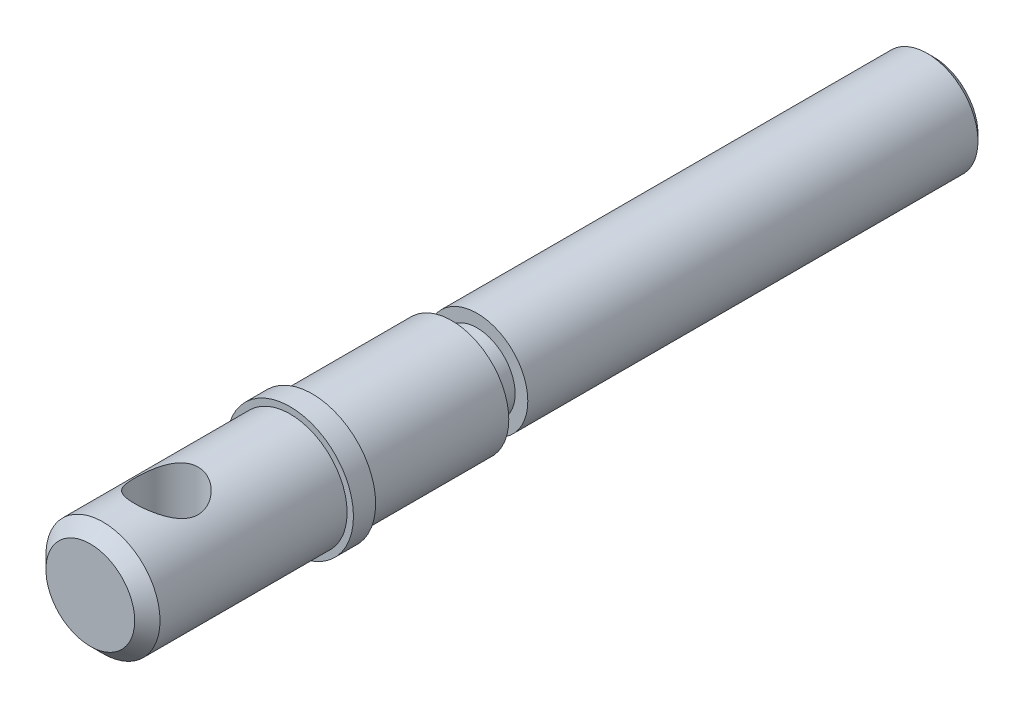
ISO-10303-21;
HEADER;
FILE_DESCRIPTION(('STEP AP214'),'2;1');
FILE_NAME('part.step','',(''),(''),'','','');
FILE_SCHEMA(('AUTOMOTIVE_DESIGN { 1 0 10303 214 1 1 1 1 }'));
ENDSEC;
DATA;
#1=APPLICATION_CONTEXT('core data for automotive mechanical design processes');
#2=APPLICATION_PROTOCOL_DEFINITION('international standard','automotive_design',2000,#1);
#3=PRODUCT_CONTEXT('',#1,'mechanical');
#4=PRODUCT('Part','Part','',(#3));
#5=PRODUCT_RELATED_PRODUCT_CATEGORY('part','',(#4));
#6=PRODUCT_DEFINITION_FORMATION('','',#4);
#7=PRODUCT_DEFINITION_CONTEXT('part definition',#1,'design');
#8=PRODUCT_DEFINITION('design','',#6,#7);
#9=PRODUCT_DEFINITION_SHAPE('','',#8);
#10=(LENGTH_UNIT() NAMED_UNIT(*) SI_UNIT(.MILLI.,.METRE.));
#11=(NAMED_UNIT(*) PLANE_ANGLE_UNIT() SI_UNIT($,.RADIAN.));
#12=(NAMED_UNIT(*) SI_UNIT($,.STERADIAN.) SOLID_ANGLE_UNIT());
#13=UNCERTAINTY_MEASURE_WITH_UNIT(LENGTH_MEASURE(1.E-05),#10,'distance_accuracy_value','');
#14=(GEOMETRIC_REPRESENTATION_CONTEXT(3) GLOBAL_UNCERTAINTY_ASSIGNED_CONTEXT((#13)) GLOBAL_UNIT_ASSIGNED_CONTEXT((#10,
#11,#12)) REPRESENTATION_CONTEXT('',''));
#15=CARTESIAN_POINT('',(0.,0.,0.));
#16=DIRECTION('',(0.,0.,1.));
#17=DIRECTION('',(1.,0.,0.));
#18=AXIS2_PLACEMENT_3D('',#15,#16,#17);
#19=CARTESIAN_POINT('',(0.,0.,72.));
#20=DIRECTION('',(0.,0.,-1.));
#21=DIRECTION('',(-1.,0.,0.));
#22=AXIS2_PLACEMENT_3D('',#19,#20,#21);
#23=CYLINDRICAL_SURFACE('',#22,8.);
#24=CARTESIAN_POINT('',(0.,0.,0.999999999999987));
#25=DIRECTION('',(0.,0.,1.));
#26=DIRECTION('',(1.,0.,0.));
#27=AXIS2_PLACEMENT_3D('',#24,#25,#26);
#28=CIRCLE('',#27,8.);
#29=CARTESIAN_POINT('',(8.,0.,0.999999999999987));
#30=VERTEX_POINT('',#29);
#31=EDGE_CURVE('E47',#30,#30,#28,.T.);
#32=ORIENTED_EDGE('',*,*,#31,.T.);
#33=EDGE_LOOP('',(#32));
#34=FACE_BOUND('',#33,.T.);
#35=CARTESIAN_POINT('',(0.,0.,72.));
#36=DIRECTION('',(0.,0.,1.));
#37=DIRECTION('',(1.,0.,0.));
#38=AXIS2_PLACEMENT_3D('',#35,#36,#37);
#39=CIRCLE('',#38,8.);
#40=CARTESIAN_POINT('',(8.,0.,72.));
#41=VERTEX_POINT('',#40);
#42=EDGE_CURVE('E141',#41,#41,#39,.T.);
#43=ORIENTED_EDGE('',*,*,#42,.F.);
#44=EDGE_LOOP('',(#43));
#45=FACE_BOUND('',#44,.T.);
#46=ADVANCED_FACE('F34',(#34,#45),#23,.T.);
#47=CARTESIAN_POINT('',(0.,0.,72.));
#48=DIRECTION('',(0.,0.,1.));
#49=DIRECTION('',(1.,0.,0.));
#50=AXIS2_PLACEMENT_3D('',#47,#48,#49);
#51=PLANE('',#50);
#52=CARTESIAN_POINT('',(0.,0.,72.));
#53=DIRECTION('',(0.,0.,1.));
#54=DIRECTION('',(1.,0.,0.));
#55=AXIS2_PLACEMENT_3D('',#52,#53,#54);
#56=CIRCLE('',#55,6.);
#57=CARTESIAN_POINT('',(6.,0.,72.));
#58=VERTEX_POINT('',#57);
#59=EDGE_CURVE('E136',#58,#58,#56,.T.);
#60=ORIENTED_EDGE('',*,*,#59,.F.);
#61=EDGE_LOOP('',(#60));
#62=FACE_BOUND('',#61,.T.);
#63=ORIENTED_EDGE('',*,*,#42,.T.);
#64=EDGE_LOOP('',(#63));
#65=FACE_BOUND('',#64,.T.);
#66=ADVANCED_FACE('F82',(#62,#65),#51,.T.);
#67=CARTESIAN_POINT('',(0.,0.,0.));
#68=DIRECTION('',(0.,0.,1.));
#69=DIRECTION('',(1.,0.,0.));
#70=AXIS2_PLACEMENT_3D('',#67,#68,#69);
#71=PLANE('',#70);
#72=CARTESIAN_POINT('',(0.,0.,0.));
#73=DIRECTION('',(0.,0.,1.));
#74=DIRECTION('',(1.,0.,0.));
#75=AXIS2_PLACEMENT_3D('',#72,#73,#74);
#76=CIRCLE('',#75,7.00000000000001);
#77=CARTESIAN_POINT('',(7.00000000000001,0.,0.));
#78=VERTEX_POINT('',#77);
#79=EDGE_CURVE('E10',#78,#78,#76,.F.);
#80=ORIENTED_EDGE('',*,*,#79,.T.);
#81=EDGE_LOOP('',(#80));
#82=FACE_BOUND('',#81,.T.);
#83=ADVANCED_FACE('F88',(#82),#71,.F.);
#84=CARTESIAN_POINT('',(0.,0.,76.));
#85=DIRECTION('',(0.,0.,-1.));
#86=DIRECTION('',(-1.,0.,0.));
#87=AXIS2_PLACEMENT_3D('',#84,#85,#86);
#88=CYLINDRICAL_SURFACE('',#87,6.);
#89=CARTESIAN_POINT('',(0.,0.,76.));
#90=DIRECTION('',(0.,0.,1.));
#91=DIRECTION('',(1.,0.,0.));
#92=AXIS2_PLACEMENT_3D('',#89,#90,#91);
#93=CIRCLE('',#92,6.);
#94=CARTESIAN_POINT('',(6.,0.,76.));
#95=VERTEX_POINT('',#94);
#96=EDGE_CURVE('E138',#95,#95,#93,.T.);
#97=ORIENTED_EDGE('',*,*,#96,.F.);
#98=EDGE_LOOP('',(#97));
#99=FACE_BOUND('',#98,.T.);
#100=ORIENTED_EDGE('',*,*,#59,.T.);
#101=EDGE_LOOP('',(#100));
#102=FACE_BOUND('',#101,.T.);
#103=ADVANCED_FACE('F94',(#99,#102),#88,.T.);
#104=CARTESIAN_POINT('',(0.,0.,98.));
#105=DIRECTION('',(0.,0.,-1.));
#106=DIRECTION('',(-1.,0.,0.));
#107=AXIS2_PLACEMENT_3D('',#104,#105,#106);
#108=CYLINDRICAL_SURFACE('',#107,9.);
#109=CARTESIAN_POINT('',(0.,0.,98.));
#110=DIRECTION('',(0.,0.,1.));
#111=DIRECTION('',(1.,0.,0.));
#112=AXIS2_PLACEMENT_3D('',#109,#110,#111);
#113=CIRCLE('',#112,9.);
#114=CARTESIAN_POINT('',(9.,0.,98.));
#115=VERTEX_POINT('',#114);
#116=EDGE_CURVE('E129',#115,#115,#113,.T.);
#117=ORIENTED_EDGE('',*,*,#116,.F.);
#118=EDGE_LOOP('',(#117));
#119=FACE_BOUND('',#118,.T.);
#120=CARTESIAN_POINT('',(0.,0.,76.));
#121=DIRECTION('',(0.,0.,1.));
#122=DIRECTION('',(1.,0.,0.));
#123=AXIS2_PLACEMENT_3D('',#120,#121,#122);
#124=CIRCLE('',#123,9.);
#125=CARTESIAN_POINT('',(9.,0.,76.));
#126=VERTEX_POINT('',#125);
#127=EDGE_CURVE('E125',#126,#126,#124,.T.);
#128=ORIENTED_EDGE('',*,*,#127,.T.);
#129=EDGE_LOOP('',(#128));
#130=FACE_BOUND('',#129,.T.);
#131=ADVANCED_FACE('F98',(#119,#130),#108,.T.);
#132=CARTESIAN_POINT('',(0.,0.,76.));
#133=DIRECTION('',(0.,0.,1.));
#134=DIRECTION('',(1.,0.,0.));
#135=AXIS2_PLACEMENT_3D('',#132,#133,#134);
#136=PLANE('',#135);
#137=ORIENTED_EDGE('',*,*,#96,.T.);
#138=EDGE_LOOP('',(#137));
#139=FACE_BOUND('',#138,.T.);
#140=ORIENTED_EDGE('',*,*,#127,.F.);
#141=EDGE_LOOP('',(#140));
#142=FACE_BOUND('',#141,.T.);
#143=ADVANCED_FACE('F102',(#139,#142),#136,.F.);
#144=CARTESIAN_POINT('',(0.,0.,101.5));
#145=DIRECTION('',(0.,0.,-1.));
#146=DIRECTION('',(-1.,0.,0.));
#147=AXIS2_PLACEMENT_3D('',#144,#145,#146);
#148=CYLINDRICAL_SURFACE('',#147,10.);
#149=CARTESIAN_POINT('',(0.,0.,101.5));
#150=DIRECTION('',(0.,0.,1.));
#151=DIRECTION('',(1.,0.,0.));
#152=AXIS2_PLACEMENT_3D('',#149,#150,#151);
#153=CIRCLE('',#152,10.);
#154=CARTESIAN_POINT('',(10.,0.,101.5));
#155=VERTEX_POINT('',#154);
#156=EDGE_CURVE('E124',#155,#155,#153,.T.);
#157=ORIENTED_EDGE('',*,*,#156,.F.);
#158=EDGE_LOOP('',(#157));
#159=FACE_BOUND('',#158,.T.);
#160=CARTESIAN_POINT('',(0.,0.,98.));
#161=DIRECTION('',(0.,0.,1.));
#162=DIRECTION('',(1.,0.,0.));
#163=AXIS2_PLACEMENT_3D('',#160,#161,#162);
#164=CIRCLE('',#163,10.);
#165=CARTESIAN_POINT('',(10.,0.,98.));
#166=VERTEX_POINT('',#165);
#167=EDGE_CURVE('E126',#166,#166,#164,.T.);
#168=ORIENTED_EDGE('',*,*,#167,.T.);
#169=EDGE_LOOP('',(#168));
#170=FACE_BOUND('',#169,.T.);
#171=ADVANCED_FACE('F106',(#159,#170),#148,.T.);
#172=CARTESIAN_POINT('',(0.,0.,101.5));
#173=DIRECTION('',(0.,0.,1.));
#174=DIRECTION('',(1.,0.,0.));
#175=AXIS2_PLACEMENT_3D('',#172,#173,#174);
#176=PLANE('',#175);
#177=CARTESIAN_POINT('',(0.,0.,101.5));
#178=DIRECTION('',(0.,0.,1.));
#179=DIRECTION('',(1.,0.,0.));
#180=AXIS2_PLACEMENT_3D('',#177,#178,#179);
#181=CIRCLE('',#180,9.);
#182=CARTESIAN_POINT('',(9.,0.,101.5));
#183=VERTEX_POINT('',#182);
#184=EDGE_CURVE('E121',#183,#183,#181,.T.);
#185=ORIENTED_EDGE('',*,*,#184,.F.);
#186=EDGE_LOOP('',(#185));
#187=FACE_BOUND('',#186,.T.);
#188=ORIENTED_EDGE('',*,*,#156,.T.);
#189=EDGE_LOOP('',(#188));
#190=FACE_BOUND('',#189,.T.);
#191=ADVANCED_FACE('F110',(#187,#190),#176,.T.);
#192=CARTESIAN_POINT('',(0.,0.,98.));
#193=DIRECTION('',(0.,0.,1.));
#194=DIRECTION('',(1.,0.,0.));
#195=AXIS2_PLACEMENT_3D('',#192,#193,#194);
#196=PLANE('',#195);
#197=ORIENTED_EDGE('',*,*,#116,.T.);
#198=EDGE_LOOP('',(#197));
#199=FACE_BOUND('',#198,.T.);
#200=ORIENTED_EDGE('',*,*,#167,.F.);
#201=EDGE_LOOP('',(#200));
#202=FACE_BOUND('',#201,.T.);
#203=ADVANCED_FACE('F78',(#199,#202),#196,.F.);
#204=CARTESIAN_POINT('',(0.,0.,133.));
#205=DIRECTION('',(0.,0.,-1.));
#206=DIRECTION('',(-1.,0.,0.));
#207=AXIS2_PLACEMENT_3D('',#204,#205,#206);
#208=CYLINDRICAL_SURFACE('',#207,9.);
#209=CARTESIAN_POINT('',(0.,-9.,126.));
#210=CARTESIAN_POINT('',(0.129728650098871,-9.00000035367436,126.000000403498));
#211=CARTESIAN_POINT('',(0.259452073794095,-8.99718916475518,125.994945729159));
#212=CARTESIAN_POINT('',(0.517921555695227,-8.98601661845686,125.974792995682));
#213=CARTESIAN_POINT('',(0.646667254114375,-8.97765330942365,125.959691404897));
#214=CARTESIAN_POINT('',(0.902114816809583,-8.955591631334,125.919644306576));
#215=CARTESIAN_POINT('',(1.02881719751597,-8.94189463304535,125.894701328271));
#216=CARTESIAN_POINT('',(1.27935747075157,-8.90950110249539,125.835269365724));
#217=CARTESIAN_POINT('',(1.40319416175913,-8.89080251301058,125.800776453257));
#218=CARTESIAN_POINT('',(1.64664425181188,-8.84894060668929,125.722798818713));
#219=CARTESIAN_POINT('',(1.76627303289198,-8.82579612337894,125.679351972301));
#220=CARTESIAN_POINT('',(2.0011801532576,-8.77551906926368,125.583816843195));
#221=CARTESIAN_POINT('',(2.11645683188322,-8.7483849950735,125.531725301991));
#222=CARTESIAN_POINT('',(2.45478877397504,-8.6618736377096,125.363188450332));
#223=CARTESIAN_POINT('',(2.67053417661058,-8.59735346727595,125.234419881894));
#224=CARTESIAN_POINT('',(3.09271229088072,-8.45507241221886,124.937807686347));
#225=CARTESIAN_POINT('',(3.29745415964199,-8.37670278285858,124.767869515605));
#226=CARTESIAN_POINT('',(3.67715998948636,-8.21711406392093,124.398353874186));
#227=CARTESIAN_POINT('',(3.85209353794296,-8.13589216491853,124.198746516894));
#228=CARTESIAN_POINT('',(4.18516795747926,-7.97009263226157,123.751305826588));
#229=CARTESIAN_POINT('',(4.33981028101033,-7.88600912242673,123.500635163402));
#230=CARTESIAN_POINT('',(4.53792036965586,-7.77258662819673,123.104541121703));
#231=CARTESIAN_POINT('',(4.59831134885592,-7.73689861013125,122.96917342162));
#232=CARTESIAN_POINT('',(4.70719976108134,-7.67113380801424,122.692446845762));
#233=CARTESIAN_POINT('',(4.75570081097956,-7.64105531823258,122.551089807306));
#234=CARTESIAN_POINT('',(4.86451848682886,-7.57250099477048,122.179994316547));
#235=CARTESIAN_POINT('',(4.91545327804221,-7.53922489494338,121.946409780324));
#236=CARTESIAN_POINT('',(4.98336969334309,-7.49451395010562,121.472499613024));
#237=CARTESIAN_POINT('',(5.00038478617411,-7.48305757595619,121.232180864358));
#238=CARTESIAN_POINT('',(4.99960164647186,-7.48358103631205,120.751345647922));
#239=CARTESIAN_POINT('',(4.98176529219689,-7.49558653424254,120.510829251615));
#240=CARTESIAN_POINT('',(4.91220969738461,-7.54134329912877,120.036841924041));
#241=CARTESIAN_POINT('',(4.86046842450359,-7.57510870603263,119.803375677421));
#242=CARTESIAN_POINT('',(4.72555331937599,-7.65998850707494,119.349136455253));
#243=CARTESIAN_POINT('',(4.64237249870864,-7.71110675816709,119.12836631439));
#244=CARTESIAN_POINT('',(4.447403175792,-7.82517266123029,118.703183346419));
#245=CARTESIAN_POINT('',(4.33560350009452,-7.88812493091397,118.498776949099));
#246=CARTESIAN_POINT('',(4.06693738507512,-8.03034742050394,118.079179713751));
#247=CARTESIAN_POINT('',(3.90580419516378,-8.11064361563465,117.867070495966));
#248=CARTESIAN_POINT('',(3.55190169354529,-8.27174396528661,117.470901072121));
#249=CARTESIAN_POINT('',(3.35910741508491,-8.3525484718906,117.286863224796));
#250=CARTESIAN_POINT('',(3.03820334696237,-8.47255594770407,117.026220382037));
#251=CARTESIAN_POINT('',(2.91988181005322,-8.51415799334354,116.938461097182));
#252=CARTESIAN_POINT('',(2.67521853140361,-8.59416899062468,116.773303132516));
#253=CARTESIAN_POINT('',(2.54887988004621,-8.63257915962084,116.695900495832));
#254=CARTESIAN_POINT('',(2.28891079019194,-8.70511911408219,116.55219791443));
#255=CARTESIAN_POINT('',(2.15528226330413,-8.73925001402195,116.485895077413));
#256=CARTESIAN_POINT('',(1.88158110652943,-8.80223607285831,116.365130437124));
#257=CARTESIAN_POINT('',(1.74150926341687,-8.83109187375265,116.31066719278));
#258=CARTESIAN_POINT('',(1.46611496312215,-8.88080389711844,116.217729967547));
#259=CARTESIAN_POINT('',(1.33115857131801,-8.90208189584859,116.178396846012));
#260=CARTESIAN_POINT('',(1.05765459084792,-8.9387020465349,116.111115438226));
#261=CARTESIAN_POINT('',(0.919107474489839,-8.95404497497797,116.083165662663));
#262=CARTESIAN_POINT('',(0.639688147055645,-8.97833234249118,116.039073648357));
#263=CARTESIAN_POINT('',(0.498817610939243,-8.98728120107926,116.022923253825));
#264=CARTESIAN_POINT('',(0.21595409747849,-8.99852157239254,116.002654386665));
#265=CARTESIAN_POINT('',(0.0739612319193928,-9.00081373995796,115.998534730534));
#266=CARTESIAN_POINT('',(-0.193661310485767,-8.99879540596083,116.002168773458));
#267=CARTESIAN_POINT('',(-0.319316398566573,-8.99520578290284,116.008626111893));
#268=CARTESIAN_POINT('',(-0.569568337701521,-8.98283315150498,116.030958036991));
#269=CARTESIAN_POINT('',(-0.69416485012835,-8.97404854042271,116.046835529937));
#270=CARTESIAN_POINT('',(-0.941327320488158,-8.95149651046085,116.087812709104));
#271=CARTESIAN_POINT('',(-1.06389401822775,-8.93773095073358,116.112908954455));
#272=CARTESIAN_POINT('',(-1.30624674826635,-8.9055432099694,116.172028885866));
#273=CARTESIAN_POINT('',(-1.42603168935625,-8.88711923415738,116.206056012973));
#274=CARTESIAN_POINT('',(-1.77910695000251,-8.82561614200696,116.320713609234));
#275=CARTESIAN_POINT('',(-2.00729552902006,-8.77619255116918,116.414119496742));
#276=CARTESIAN_POINT('',(-2.44488800886301,-8.66450874935681,116.631660166924));
#277=CARTESIAN_POINT('',(-2.65428686245935,-8.6022451040581,116.75580317263));
#278=CARTESIAN_POINT('',(-3.07172957903526,-8.46272453532917,117.045821972293));
#279=CARTESIAN_POINT('',(-3.27740782973052,-8.38458363909743,117.214680855635));
#280=CARTESIAN_POINT('',(-3.65908152653597,-8.22520611371521,117.582186795455));
#281=CARTESIAN_POINT('',(-3.83504389654575,-8.14396615672223,117.780866586534));
#282=CARTESIAN_POINT('',(-4.17023823002671,-7.97793731767648,118.226123095256));
#283=CARTESIAN_POINT('',(-4.32600004905647,-7.89361512920965,118.475508481209));
#284=CARTESIAN_POINT('',(-4.59275891633597,-7.74146523733294,119.001689370523));
#285=CARTESIAN_POINT('',(-4.70381927827813,-7.67361425911822,119.278445409452));
#286=CARTESIAN_POINT('',(-4.85777774830002,-7.57683809208936,119.792433927955));
#287=CARTESIAN_POINT('',(-4.91005771973349,-7.5427474465653,120.025882534407));
#288=CARTESIAN_POINT('',(-4.98067851749207,-7.49631291383466,120.499893284941));
#289=CARTESIAN_POINT('',(-4.99905324495845,-7.48394730481337,120.740448078837));
#290=CARTESIAN_POINT('',(-5.00087641660016,-7.4827292389407,121.222043485471));
#291=CARTESIAN_POINT('',(-4.98428138030366,-7.49390605410459,121.463084330288));
#292=CARTESIAN_POINT('',(-4.91703272116073,-7.5381922351137,121.938336075563));
#293=CARTESIAN_POINT('',(-4.86635734965788,-7.57131560614076,122.172542514943));
#294=CARTESIAN_POINT('',(-4.73359019709714,-7.65501053053173,122.627637340616));
#295=CARTESIAN_POINT('',(-4.65159333262121,-7.7055293237003,122.848563652545));
#296=CARTESIAN_POINT('',(-4.45898685237774,-7.81855933555385,123.274218021757));
#297=CARTESIAN_POINT('',(-4.34836621460617,-7.88107517147513,123.478939799502));
#298=CARTESIAN_POINT('',(-4.08239378948777,-8.02246926398218,123.899118337509));
#299=CARTESIAN_POINT('',(-3.92281334521186,-8.10239358916594,124.111543878647));
#300=CARTESIAN_POINT('',(-3.57208449742688,-8.26301218742008,124.508615204111));
#301=CARTESIAN_POINT('',(-3.38091059241462,-8.34370703244943,124.693238314983));
#302=CARTESIAN_POINT('',(-3.06226198232623,-8.46388232404898,124.955266470803));
#303=CARTESIAN_POINT('',(-2.94454455618599,-8.50565265713109,125.043691062892));
#304=CARTESIAN_POINT('',(-2.70104919272108,-8.5860784208833,125.210233533147));
#305=CARTESIAN_POINT('',(-2.57527433671188,-8.62473502968511,125.288355316759));
#306=CARTESIAN_POINT('',(-2.31639114532808,-8.69784009103004,125.43354865083));
#307=CARTESIAN_POINT('',(-2.18328521880677,-8.73228991401566,125.500623802441));
#308=CARTESIAN_POINT('',(-1.91056755470904,-8.79598351699736,125.622992228043));
#309=CARTESIAN_POINT('',(-1.77095673345214,-8.82522802746501,125.678287155392));
#310=CARTESIAN_POINT('',(-1.49912870468087,-8.87524400995768,125.771936373452));
#311=CARTESIAN_POINT('',(-1.36737917982355,-8.89654158296884,125.811368321224));
#312=CARTESIAN_POINT('',(-1.10033791857094,-8.93349970483441,125.879368096818));
#313=CARTESIAN_POINT('',(-0.965046657250126,-8.94916100560194,125.907937373815));
#314=CARTESIAN_POINT('',(-0.692088324433112,-8.97439622187978,125.953802009618));
#315=CARTESIAN_POINT('',(-0.554422765939952,-8.98397387690143,125.971104294214));
#316=CARTESIAN_POINT('',(-0.277836098507378,-8.99677541735903,125.994202784995));
#317=CARTESIAN_POINT('',(-0.138915052853805,-8.9999996212811,125.999999567929));
#318=CARTESIAN_POINT('',(0.,-9.,126.));
#319=B_SPLINE_CURVE_WITH_KNOTS('',3,(#209,#210,#211,#212,#213,#214,#215,#216,#217,#218,#219,
#220,#221,#222,#223,#224,#225,#226,#227,#228,#229,#230,#231,#232,#233,#234,#235,#236,#237,#238,
#239,#240,#241,#242,#243,#244,#245,#246,#247,#248,#249,#250,#251,#252,#253,#254,#255,#256,#257,
#258,#259,#260,#261,#262,#263,#264,#265,#266,#267,#268,#269,#270,#271,#272,#273,#274,#275,#276,
#277,#278,#279,#280,#281,#282,#283,#284,#285,#286,#287,#288,#289,#290,#291,#292,#293,#294,#295,
#296,#297,#298,#299,#300,#301,#302,#303,#304,#305,#306,#307,#308,#309,#310,#311,#312,#313,#314,
#315,#316,#317,#318),.UNSPECIFIED.,.T.,.F.,(4,2,2,2,2,2,2,2,2,2,2,2,2,2,2,2,2,2,2,2,2,2,2,2,2,2,
2,2,2,2,2,2,2,2,2,2,2,2,2,2,2,2,2,2,2,2,2,2,2,2,2,2,2,2,4),(0.,0.389049038673796,
0.778234906423186,1.16732081864409,1.55656701401969,1.94419928087583,2.33197799415706,
3.10694003691383,3.93579164360749,4.76548390659347,5.67926108729745,6.13607645300719,
6.59275268424476,7.31346839098545,8.03347261109579,8.75426483810458,9.47552592073739,
10.1969474205329,10.9186510103256,11.7500289468904,12.5820656531715,13.0407937204138,
13.4993460219527,13.9577786509197,14.4161554498582,14.8420733324614,15.2679354732486,
15.6935029768355,16.1190286145523,16.4961868590171,16.8734615239822,17.2505955151925,
17.6278750290088,18.3788772686743,19.1300806397395,19.9587345054797,20.7883047338674,
21.7014293455293,22.613256047122,23.3350470842321,24.0561160257529,24.778082054147,
25.5005092490548,26.2207643506841,26.9412972109114,27.7704094124313,28.6001941523198,
29.05881328468,29.5172580673313,29.9755531019595,30.4337837723653,30.8507153459596,
31.2675912777015,31.684210714444,32.100809266336),.UNSPECIFIED.);
#320=CARTESIAN_POINT('',(0.,-9.,126.));
#321=VERTEX_POINT('',#320);
#322=EDGE_CURVE('E38',#321,#321,#319,.T.);
#323=ORIENTED_EDGE('',*,*,#322,.T.);
#324=EDGE_LOOP('',(#323));
#325=FACE_BOUND('',#324,.T.);
#326=CARTESIAN_POINT('',(0.,9.,126.));
#327=CARTESIAN_POINT('',(-0.129728650098871,9.00000035367436,126.000000403498));
#328=CARTESIAN_POINT('',(-0.259452073794095,8.99718916475518,125.994945729159));
#329=CARTESIAN_POINT('',(-0.517921555695227,8.98601661845686,125.974792995682));
#330=CARTESIAN_POINT('',(-0.646667254114375,8.97765330942365,125.959691404897));
#331=CARTESIAN_POINT('',(-0.902114816809583,8.955591631334,125.919644306576));
#332=CARTESIAN_POINT('',(-1.02881719751597,8.94189463304535,125.894701328271));
#333=CARTESIAN_POINT('',(-1.27935747075157,8.90950110249539,125.835269365724));
#334=CARTESIAN_POINT('',(-1.40319416175913,8.89080251301058,125.800776453257));
#335=CARTESIAN_POINT('',(-1.64664425181188,8.84894060668929,125.722798818713));
#336=CARTESIAN_POINT('',(-1.76627303289198,8.82579612337894,125.679351972301));
#337=CARTESIAN_POINT('',(-2.0011801532576,8.77551906926368,125.583816843195));
#338=CARTESIAN_POINT('',(-2.11645683188322,8.7483849950735,125.531725301991));
#339=CARTESIAN_POINT('',(-2.45478877397504,8.6618736377096,125.363188450332));
#340=CARTESIAN_POINT('',(-2.67053417661058,8.59735346727595,125.234419881894));
#341=CARTESIAN_POINT('',(-3.09271229088072,8.45507241221886,124.937807686347));
#342=CARTESIAN_POINT('',(-3.29745415964199,8.37670278285858,124.767869515605));
#343=CARTESIAN_POINT('',(-3.67715998948636,8.21711406392093,124.398353874186));
#344=CARTESIAN_POINT('',(-3.85209353794296,8.13589216491853,124.198746516894));
#345=CARTESIAN_POINT('',(-4.18516795747926,7.97009263226157,123.751305826588));
#346=CARTESIAN_POINT('',(-4.33981028101033,7.88600912242673,123.500635163402));
#347=CARTESIAN_POINT('',(-4.53792036965586,7.77258662819673,123.104541121703));
#348=CARTESIAN_POINT('',(-4.59831134885592,7.73689861013125,122.96917342162));
#349=CARTESIAN_POINT('',(-4.70719976108134,7.67113380801424,122.692446845762));
#350=CARTESIAN_POINT('',(-4.75570081097956,7.64105531823258,122.551089807306));
#351=CARTESIAN_POINT('',(-4.86451848682886,7.57250099477048,122.179994316547));
#352=CARTESIAN_POINT('',(-4.91545327804221,7.53922489494338,121.946409780324));
#353=CARTESIAN_POINT('',(-4.98336969334309,7.49451395010562,121.472499613024));
#354=CARTESIAN_POINT('',(-5.00038478617411,7.48305757595619,121.232180864358));
#355=CARTESIAN_POINT('',(-4.99960164647186,7.48358103631205,120.751345647922));
#356=CARTESIAN_POINT('',(-4.98176529219689,7.49558653424254,120.510829251615));
#357=CARTESIAN_POINT('',(-4.91220969738461,7.54134329912877,120.036841924041));
#358=CARTESIAN_POINT('',(-4.86046842450359,7.57510870603263,119.803375677421));
#359=CARTESIAN_POINT('',(-4.72555331937599,7.65998850707494,119.349136455253));
#360=CARTESIAN_POINT('',(-4.64237249870864,7.71110675816709,119.12836631439));
#361=CARTESIAN_POINT('',(-4.447403175792,7.82517266123029,118.703183346419));
#362=CARTESIAN_POINT('',(-4.33560350009452,7.88812493091397,118.498776949099));
#363=CARTESIAN_POINT('',(-4.06693738507512,8.03034742050394,118.079179713751));
#364=CARTESIAN_POINT('',(-3.90580419516378,8.11064361563465,117.867070495966));
#365=CARTESIAN_POINT('',(-3.55190169354529,8.27174396528661,117.470901072121));
#366=CARTESIAN_POINT('',(-3.35910741508491,8.3525484718906,117.286863224796));
#367=CARTESIAN_POINT('',(-3.03820334696237,8.47255594770407,117.026220382037));
#368=CARTESIAN_POINT('',(-2.91988181005322,8.51415799334354,116.938461097182));
#369=CARTESIAN_POINT('',(-2.67521853140361,8.59416899062468,116.773303132516));
#370=CARTESIAN_POINT('',(-2.54887988004621,8.63257915962084,116.695900495832));
#371=CARTESIAN_POINT('',(-2.28891079019194,8.70511911408219,116.55219791443));
#372=CARTESIAN_POINT('',(-2.15528226330413,8.73925001402195,116.485895077413));
#373=CARTESIAN_POINT('',(-1.88158110652943,8.80223607285831,116.365130437124));
#374=CARTESIAN_POINT('',(-1.74150926341687,8.83109187375265,116.31066719278));
#375=CARTESIAN_POINT('',(-1.46611496312215,8.88080389711844,116.217729967547));
#376=CARTESIAN_POINT('',(-1.33115857131801,8.90208189584859,116.178396846012));
#377=CARTESIAN_POINT('',(-1.05765459084792,8.9387020465349,116.111115438226));
#378=CARTESIAN_POINT('',(-0.919107474489839,8.95404497497797,116.083165662663));
#379=CARTESIAN_POINT('',(-0.639688147055645,8.97833234249118,116.039073648357));
#380=CARTESIAN_POINT('',(-0.498817610939243,8.98728120107926,116.022923253825));
#381=CARTESIAN_POINT('',(-0.21595409747849,8.99852157239254,116.002654386665));
#382=CARTESIAN_POINT('',(-0.0739612319193928,9.00081373995796,115.998534730534));
#383=CARTESIAN_POINT('',(0.193661310485767,8.99879540596083,116.002168773458));
#384=CARTESIAN_POINT('',(0.319316398566573,8.99520578290284,116.008626111893));
#385=CARTESIAN_POINT('',(0.569568337701521,8.98283315150498,116.030958036991));
#386=CARTESIAN_POINT('',(0.69416485012835,8.97404854042271,116.046835529937));
#387=CARTESIAN_POINT('',(0.941327320488158,8.95149651046085,116.087812709104));
#388=CARTESIAN_POINT('',(1.06389401822775,8.93773095073358,116.112908954455));
#389=CARTESIAN_POINT('',(1.30624674826635,8.9055432099694,116.172028885866));
#390=CARTESIAN_POINT('',(1.42603168935625,8.88711923415738,116.206056012973));
#391=CARTESIAN_POINT('',(1.77910695000251,8.82561614200696,116.320713609234));
#392=CARTESIAN_POINT('',(2.00729552902006,8.77619255116918,116.414119496742));
#393=CARTESIAN_POINT('',(2.44488800886301,8.66450874935681,116.631660166924));
#394=CARTESIAN_POINT('',(2.65428686245935,8.6022451040581,116.75580317263));
#395=CARTESIAN_POINT('',(3.07172957903526,8.46272453532917,117.045821972293));
#396=CARTESIAN_POINT('',(3.27740782973052,8.38458363909743,117.214680855635));
#397=CARTESIAN_POINT('',(3.65908152653597,8.22520611371521,117.582186795455));
#398=CARTESIAN_POINT('',(3.83504389654575,8.14396615672223,117.780866586534));
#399=CARTESIAN_POINT('',(4.17023823002671,7.97793731767648,118.226123095256));
#400=CARTESIAN_POINT('',(4.32600004905647,7.89361512920965,118.475508481209));
#401=CARTESIAN_POINT('',(4.59275891633597,7.74146523733294,119.001689370523));
#402=CARTESIAN_POINT('',(4.70381927827813,7.67361425911822,119.278445409452));
#403=CARTESIAN_POINT('',(4.85777774830002,7.57683809208936,119.792433927955));
#404=CARTESIAN_POINT('',(4.91005771973349,7.5427474465653,120.025882534407));
#405=CARTESIAN_POINT('',(4.98067851749207,7.49631291383466,120.499893284941));
#406=CARTESIAN_POINT('',(4.99905324495845,7.48394730481337,120.740448078837));
#407=CARTESIAN_POINT('',(5.00087641660016,7.4827292389407,121.222043485471));
#408=CARTESIAN_POINT('',(4.98428138030366,7.49390605410459,121.463084330288));
#409=CARTESIAN_POINT('',(4.91703272116073,7.5381922351137,121.938336075563));
#410=CARTESIAN_POINT('',(4.86635734965788,7.57131560614076,122.172542514943));
#411=CARTESIAN_POINT('',(4.73359019709714,7.65501053053173,122.627637340616));
#412=CARTESIAN_POINT('',(4.65159333262121,7.7055293237003,122.848563652545));
#413=CARTESIAN_POINT('',(4.45898685237774,7.81855933555385,123.274218021757));
#414=CARTESIAN_POINT('',(4.34836621460617,7.88107517147513,123.478939799502));
#415=CARTESIAN_POINT('',(4.08239378948777,8.02246926398218,123.899118337509));
#416=CARTESIAN_POINT('',(3.92281334521186,8.10239358916594,124.111543878647));
#417=CARTESIAN_POINT('',(3.57208449742688,8.26301218742008,124.508615204111));
#418=CARTESIAN_POINT('',(3.38091059241462,8.34370703244943,124.693238314983));
#419=CARTESIAN_POINT('',(3.06226198232623,8.46388232404898,124.955266470803));
#420=CARTESIAN_POINT('',(2.94454455618599,8.50565265713109,125.043691062892));
#421=CARTESIAN_POINT('',(2.70104919272108,8.5860784208833,125.210233533147));
#422=CARTESIAN_POINT('',(2.57527433671188,8.62473502968511,125.288355316759));
#423=CARTESIAN_POINT('',(2.31639114532808,8.69784009103004,125.43354865083));
#424=CARTESIAN_POINT('',(2.18328521880677,8.73228991401566,125.500623802441));
#425=CARTESIAN_POINT('',(1.91056755470904,8.79598351699736,125.622992228043));
#426=CARTESIAN_POINT('',(1.77095673345214,8.82522802746501,125.678287155392));
#427=CARTESIAN_POINT('',(1.49912870468087,8.87524400995768,125.771936373452));
#428=CARTESIAN_POINT('',(1.36737917982355,8.89654158296884,125.811368321224));
#429=CARTESIAN_POINT('',(1.10033791857094,8.93349970483441,125.879368096818));
#430=CARTESIAN_POINT('',(0.965046657250126,8.94916100560194,125.907937373815));
#431=CARTESIAN_POINT('',(0.692088324433112,8.97439622187978,125.953802009618));
#432=CARTESIAN_POINT('',(0.554422765939952,8.98397387690143,125.971104294214));
#433=CARTESIAN_POINT('',(0.277836098507378,8.99677541735903,125.994202784995));
#434=CARTESIAN_POINT('',(0.138915052853805,8.9999996212811,125.999999567929));
#435=CARTESIAN_POINT('',(0.,9.,126.));
#436=B_SPLINE_CURVE_WITH_KNOTS('',3,(#326,#327,#328,#329,#330,#331,#332,#333,#334,#335,#336,
#337,#338,#339,#340,#341,#342,#343,#344,#345,#346,#347,#348,#349,#350,#351,#352,#353,#354,#355,
#356,#357,#358,#359,#360,#361,#362,#363,#364,#365,#366,#367,#368,#369,#370,#371,#372,#373,#374,
#375,#376,#377,#378,#379,#380,#381,#382,#383,#384,#385,#386,#387,#388,#389,#390,#391,#392,#393,
#394,#395,#396,#397,#398,#399,#400,#401,#402,#403,#404,#405,#406,#407,#408,#409,#410,#411,#412,
#413,#414,#415,#416,#417,#418,#419,#420,#421,#422,#423,#424,#425,#426,#427,#428,#429,#430,#431,
#432,#433,#434,#435),.UNSPECIFIED.,.T.,.F.,(4,2,2,2,2,2,2,2,2,2,2,2,2,2,2,2,2,2,2,2,2,2,2,2,2,2,
2,2,2,2,2,2,2,2,2,2,2,2,2,2,2,2,2,2,2,2,2,2,2,2,2,2,2,2,4),(0.,0.389049038673796,
0.778234906423186,1.16732081864409,1.55656701401969,1.94419928087583,2.33197799415706,
3.10694003691383,3.93579164360749,4.76548390659347,5.67926108729745,6.13607645300719,
6.59275268424476,7.31346839098545,8.03347261109579,8.75426483810458,9.47552592073739,
10.1969474205329,10.9186510103256,11.7500289468904,12.5820656531715,13.0407937204138,
13.4993460219527,13.9577786509197,14.4161554498582,14.8420733324614,15.2679354732486,
15.6935029768355,16.1190286145523,16.4961868590171,16.8734615239822,17.2505955151925,
17.6278750290088,18.3788772686743,19.1300806397395,19.9587345054797,20.7883047338674,
21.7014293455293,22.613256047122,23.3350470842321,24.0561160257529,24.778082054147,
25.5005092490548,26.2207643506841,26.9412972109114,27.7704094124313,28.6001941523198,
29.05881328468,29.5172580673313,29.9755531019595,30.4337837723653,30.8507153459596,
31.2675912777015,31.684210714444,32.100809266336),.UNSPECIFIED.);
#437=CARTESIAN_POINT('',(0.,9.,126.));
#438=VERTEX_POINT('',#437);
#439=EDGE_CURVE('E55',#438,#438,#436,.T.);
#440=ORIENTED_EDGE('',*,*,#439,.T.);
#441=EDGE_LOOP('',(#440));
#442=FACE_BOUND('',#441,.T.);
#443=CARTESIAN_POINT('',(0.,0.,131.));
#444=DIRECTION('',(0.,0.,1.));
#445=DIRECTION('',(1.,0.,0.));
#446=AXIS2_PLACEMENT_3D('',#443,#444,#445);
#447=CIRCLE('',#446,9.);
#448=CARTESIAN_POINT('',(9.,0.,131.));
#449=VERTEX_POINT('',#448);
#450=EDGE_CURVE('E52',#449,#449,#447,.F.);
#451=ORIENTED_EDGE('',*,*,#450,.T.);
#452=EDGE_LOOP('',(#451));
#453=FACE_BOUND('',#452,.T.);
#454=ORIENTED_EDGE('',*,*,#184,.T.);
#455=EDGE_LOOP('',(#454));
#456=FACE_BOUND('',#455,.T.);
#457=ADVANCED_FACE('F60',(#325,#442,#453,#456),#208,.T.);
#458=CARTESIAN_POINT('',(0.,0.,133.));
#459=DIRECTION('',(0.,0.,1.));
#460=DIRECTION('',(1.,0.,0.));
#461=AXIS2_PLACEMENT_3D('',#458,#459,#460);
#462=PLANE('',#461);
#463=CARTESIAN_POINT('',(0.,0.,133.));
#464=DIRECTION('',(0.,0.,1.));
#465=DIRECTION('',(1.,0.,0.));
#466=AXIS2_PLACEMENT_3D('',#463,#464,#465);
#467=CIRCLE('',#466,7.00000000000001);
#468=CARTESIAN_POINT('',(7.00000000000001,0.,133.));
#469=VERTEX_POINT('',#468);
#470=EDGE_CURVE('E146',#469,#469,#467,.T.);
#471=ORIENTED_EDGE('',*,*,#470,.T.);
#472=EDGE_LOOP('',(#471));
#473=FACE_BOUND('',#472,.T.);
#474=ADVANCED_FACE('F68',(#473),#462,.T.);
#475=CARTESIAN_POINT('',(0.,0.,133.));
#476=DIRECTION('',(0.,0.,-1.));
#477=DIRECTION('',(-1.,0.,0.));
#478=AXIS2_PLACEMENT_3D('',#475,#476,#477);
#479=CONICAL_SURFACE('',#478,7.00000000000001,0.785398163397439);
#480=ORIENTED_EDGE('',*,*,#450,.F.);
#481=EDGE_LOOP('',(#480));
#482=FACE_BOUND('',#481,.T.);
#483=ORIENTED_EDGE('',*,*,#470,.F.);
#484=EDGE_LOOP('',(#483));
#485=FACE_BOUND('',#484,.T.);
#486=ADVANCED_FACE('F71',(#482,#485),#479,.T.);
#487=CARTESIAN_POINT('',(0.,0.,0.999999999999987));
#488=DIRECTION('',(0.,0.,1.));
#489=DIRECTION('',(1.,0.,0.));
#490=AXIS2_PLACEMENT_3D('',#487,#488,#489);
#491=CONICAL_SURFACE('',#490,8.,0.785398163397452);
#492=ORIENTED_EDGE('',*,*,#79,.F.);
#493=EDGE_LOOP('',(#492));
#494=FACE_BOUND('',#493,.T.);
#495=ORIENTED_EDGE('',*,*,#31,.F.);
#496=EDGE_LOOP('',(#495));
#497=FACE_BOUND('',#496,.T.);
#498=ADVANCED_FACE('F36',(#494,#497),#491,.T.);
#499=CARTESIAN_POINT('',(0.,-10.,121.));
#500=DIRECTION('',(0.,1.,0.));
#501=DIRECTION('',(0.,0.,1.));
#502=AXIS2_PLACEMENT_3D('',#499,#500,#501);
#503=CYLINDRICAL_SURFACE('',#502,5.);
#504=ORIENTED_EDGE('',*,*,#439,.F.);
#505=EDGE_LOOP('',(#504));
#506=FACE_BOUND('',#505,.T.);
#507=ORIENTED_EDGE('',*,*,#322,.F.);
#508=EDGE_LOOP('',(#507));
#509=FACE_BOUND('',#508,.T.);
#510=ADVANCED_FACE('F64',(#506,#509),#503,.F.);
#511=CLOSED_SHELL('',(#46,#66,#83,#103,#131,#143,#171,#191,#203,#457,#474,#486,#498,#510));
#512=MANIFOLD_SOLID_BREP('B2',#511);
#513=ADVANCED_BREP_SHAPE_REPRESENTATION('',(#18,#512),#14);
#514=SHAPE_DEFINITION_REPRESENTATION(#9,#513);
ENDSEC;
END-ISO-10303-21;
